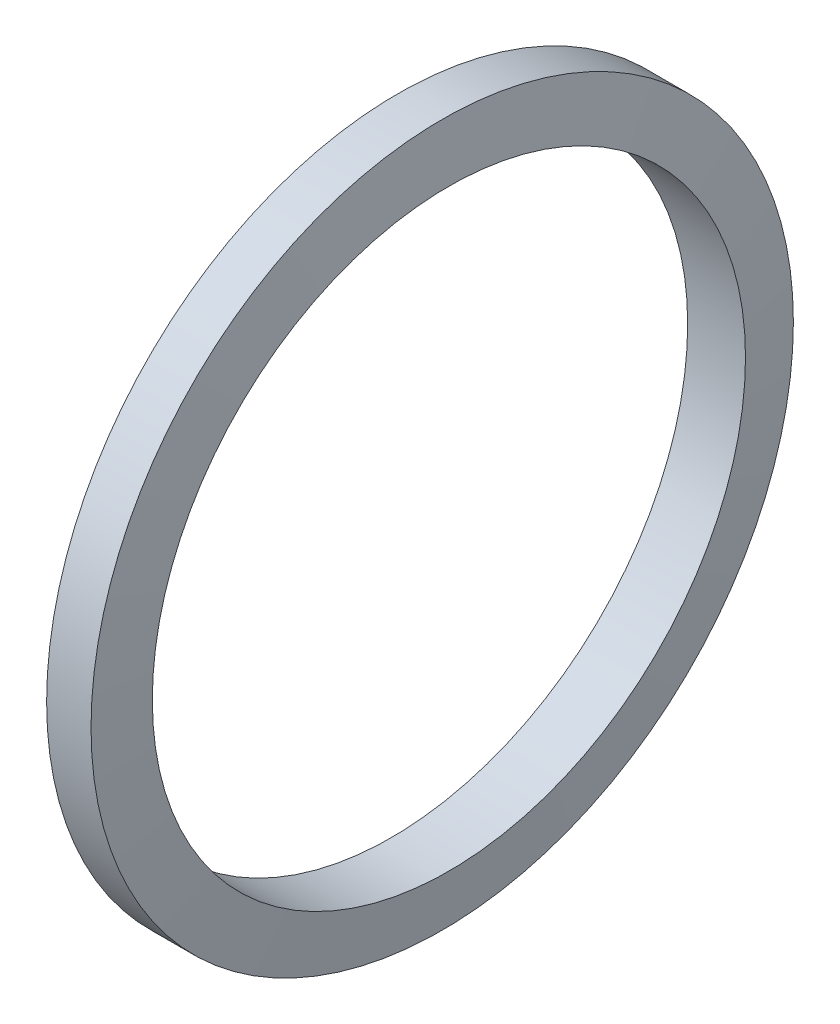
ISO-10303-21;
HEADER;
FILE_DESCRIPTION(('STEP AP214'),'2;1');
FILE_NAME('part.step','',(''),(''),'','','');
FILE_SCHEMA(('AUTOMOTIVE_DESIGN { 1 0 10303 214 1 1 1 1 }'));
ENDSEC;
DATA;
#1=APPLICATION_CONTEXT('core data for automotive mechanical design processes');
#2=APPLICATION_PROTOCOL_DEFINITION('international standard','automotive_design',2000,#1);
#3=PRODUCT_CONTEXT('',#1,'mechanical');
#4=PRODUCT('Part','Part','',(#3));
#5=PRODUCT_RELATED_PRODUCT_CATEGORY('part','',(#4));
#6=PRODUCT_DEFINITION_FORMATION('','',#4);
#7=PRODUCT_DEFINITION_CONTEXT('part definition',#1,'design');
#8=PRODUCT_DEFINITION('design','',#6,#7);
#9=PRODUCT_DEFINITION_SHAPE('','',#8);
#10=(LENGTH_UNIT() NAMED_UNIT(*) SI_UNIT(.MILLI.,.METRE.));
#11=(NAMED_UNIT(*) PLANE_ANGLE_UNIT() SI_UNIT($,.RADIAN.));
#12=(NAMED_UNIT(*) SI_UNIT($,.STERADIAN.) SOLID_ANGLE_UNIT());
#13=UNCERTAINTY_MEASURE_WITH_UNIT(LENGTH_MEASURE(1.E-05),#10,'distance_accuracy_value','');
#14=(GEOMETRIC_REPRESENTATION_CONTEXT(3) GLOBAL_UNCERTAINTY_ASSIGNED_CONTEXT((#13)) GLOBAL_UNIT_ASSIGNED_CONTEXT((#10,
#11,#12)) REPRESENTATION_CONTEXT('',''));
#15=CARTESIAN_POINT('',(0.,0.,0.));
#16=DIRECTION('',(0.,0.,1.));
#17=DIRECTION('',(1.,0.,0.));
#18=AXIS2_PLACEMENT_3D('',#15,#16,#17);
#19=CARTESIAN_POINT('',(-2.61632380420905,0.,0.));
#20=DIRECTION('',(-1.,0.,0.));
#21=DIRECTION('',(0.,0.,1.));
#22=AXIS2_PLACEMENT_3D('',#19,#20,#21);
#23=CYLINDRICAL_SURFACE('',#22,80.15);
#24=CARTESIAN_POINT('',(7.81107227331786,0.,0.));
#25=DIRECTION('',(-1.,0.,0.));
#26=DIRECTION('',(0.,0.,1.));
#27=AXIS2_PLACEMENT_3D('',#24,#25,#26);
#28=CIRCLE('',#27,80.15);
#29=CARTESIAN_POINT('',(7.81107227331786,0.,80.15));
#30=VERTEX_POINT('',#29);
#31=EDGE_CURVE('E10',#30,#30,#28,.T.);
#32=ORIENTED_EDGE('',*,*,#31,.F.);
#33=EDGE_LOOP('',(#32));
#34=FACE_BOUND('',#33,.T.);
#35=CARTESIAN_POINT('',(-7.81107227331774,0.,0.));
#36=DIRECTION('',(-1.,0.,0.));
#37=DIRECTION('',(0.,0.,1.));
#38=AXIS2_PLACEMENT_3D('',#35,#36,#37);
#39=CIRCLE('',#38,80.15);
#40=CARTESIAN_POINT('',(-7.81107227331774,0.,80.15));
#41=VERTEX_POINT('',#40);
#42=EDGE_CURVE('E45',#41,#41,#39,.T.);
#43=ORIENTED_EDGE('',*,*,#42,.T.);
#44=EDGE_LOOP('',(#43));
#45=FACE_BOUND('',#44,.T.);
#46=ADVANCED_FACE('F31',(#34,#45),#23,.F.);
#47=CARTESIAN_POINT('',(7.81107227331786,0.,0.));
#48=DIRECTION('',(-1.,0.,0.));
#49=DIRECTION('',(0.,0.,1.));
#50=AXIS2_PLACEMENT_3D('',#47,#48,#49);
#51=CONICAL_SURFACE('',#50,80.15,1.44862327915529);
#52=CARTESIAN_POINT('',(6.,0.,0.));
#53=DIRECTION('',(-1.,0.,0.));
#54=DIRECTION('',(0.,0.,1.));
#55=AXIS2_PLACEMENT_3D('',#52,#53,#54);
#56=CIRCLE('',#55,94.9);
#57=CARTESIAN_POINT('',(6.,0.,94.9));
#58=VERTEX_POINT('',#57);
#59=EDGE_CURVE('E37',#58,#58,#56,.T.);
#60=ORIENTED_EDGE('',*,*,#59,.F.);
#61=EDGE_LOOP('',(#60));
#62=FACE_BOUND('',#61,.T.);
#63=ORIENTED_EDGE('',*,*,#31,.T.);
#64=EDGE_LOOP('',(#63));
#65=FACE_BOUND('',#64,.T.);
#66=ADVANCED_FACE('F60',(#62,#65),#51,.T.);
#67=CARTESIAN_POINT('',(-2.61632380420905,0.,0.));
#68=DIRECTION('',(-1.,0.,0.));
#69=DIRECTION('',(0.,0.,1.));
#70=AXIS2_PLACEMENT_3D('',#67,#68,#69);
#71=CYLINDRICAL_SURFACE('',#70,94.9);
#72=CARTESIAN_POINT('',(-6.,0.,0.));
#73=DIRECTION('',(-1.,0.,0.));
#74=DIRECTION('',(0.,0.,1.));
#75=AXIS2_PLACEMENT_3D('',#72,#73,#74);
#76=CIRCLE('',#75,94.9);
#77=CARTESIAN_POINT('',(-6.,0.,94.9));
#78=VERTEX_POINT('',#77);
#79=EDGE_CURVE('E41',#78,#78,#76,.T.);
#80=ORIENTED_EDGE('',*,*,#79,.F.);
#81=EDGE_LOOP('',(#80));
#82=FACE_BOUND('',#81,.T.);
#83=ORIENTED_EDGE('',*,*,#59,.T.);
#84=EDGE_LOOP('',(#83));
#85=FACE_BOUND('',#84,.T.);
#86=ADVANCED_FACE('F55',(#82,#85),#71,.T.);
#87=CARTESIAN_POINT('',(-6.,0.,0.));
#88=DIRECTION('',(1.,0.,0.));
#89=DIRECTION('',(0.,0.,-1.));
#90=AXIS2_PLACEMENT_3D('',#87,#88,#89);
#91=CONICAL_SURFACE('',#90,94.9,1.4486232791553);
#92=ORIENTED_EDGE('',*,*,#42,.F.);
#93=EDGE_LOOP('',(#92));
#94=FACE_BOUND('',#93,.T.);
#95=ORIENTED_EDGE('',*,*,#79,.T.);
#96=EDGE_LOOP('',(#95));
#97=FACE_BOUND('',#96,.T.);
#98=ADVANCED_FACE('F52',(#94,#97),#91,.T.);
#99=CLOSED_SHELL('',(#46,#66,#86,#98));
#100=MANIFOLD_SOLID_BREP('B2',#99);
#101=ADVANCED_BREP_SHAPE_REPRESENTATION('',(#18,#100),#14);
#102=SHAPE_DEFINITION_REPRESENTATION(#9,#101);
ENDSEC;
END-ISO-10303-21;
